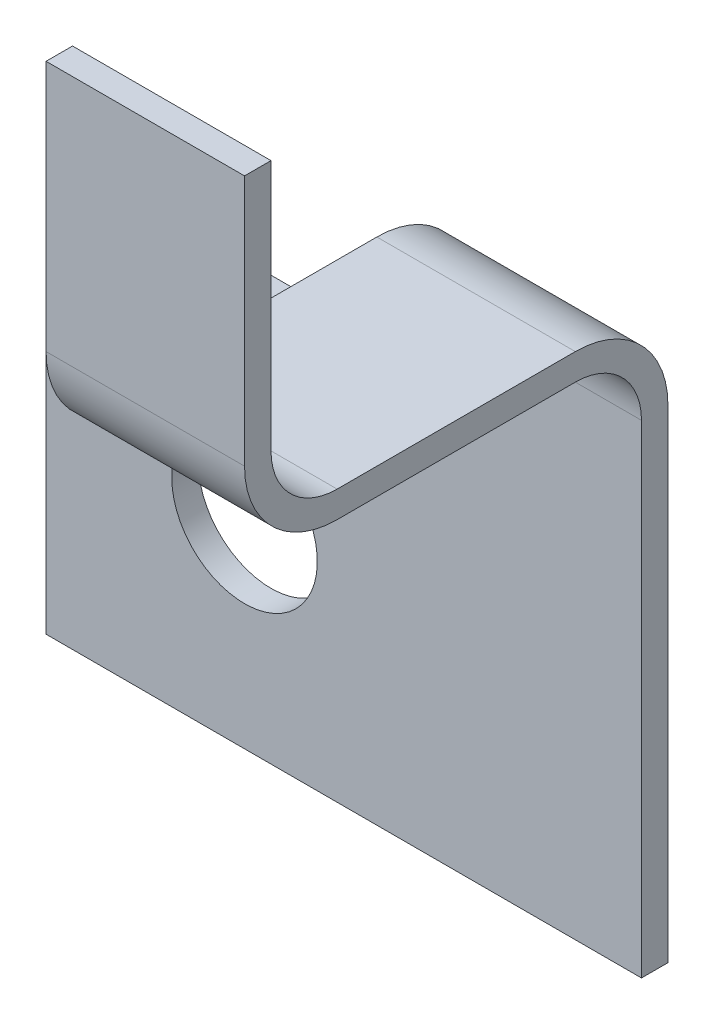
ISO-10303-21;
HEADER;
FILE_DESCRIPTION(('STEP AP214'),'2;1');
FILE_NAME('part.step','',(''),(''),'','','');
FILE_SCHEMA(('AUTOMOTIVE_DESIGN { 1 0 10303 214 1 1 1 1 }'));
ENDSEC;
DATA;
#1=APPLICATION_CONTEXT('core data for automotive mechanical design processes');
#2=APPLICATION_PROTOCOL_DEFINITION('international standard','automotive_design',2000,#1);
#3=PRODUCT_CONTEXT('',#1,'mechanical');
#4=PRODUCT('Part','Part','',(#3));
#5=PRODUCT_RELATED_PRODUCT_CATEGORY('part','',(#4));
#6=PRODUCT_DEFINITION_FORMATION('','',#4);
#7=PRODUCT_DEFINITION_CONTEXT('part definition',#1,'design');
#8=PRODUCT_DEFINITION('design','',#6,#7);
#9=PRODUCT_DEFINITION_SHAPE('','',#8);
#10=(LENGTH_UNIT() NAMED_UNIT(*) SI_UNIT(.MILLI.,.METRE.));
#11=(NAMED_UNIT(*) PLANE_ANGLE_UNIT() SI_UNIT($,.RADIAN.));
#12=(NAMED_UNIT(*) SI_UNIT($,.STERADIAN.) SOLID_ANGLE_UNIT());
#13=UNCERTAINTY_MEASURE_WITH_UNIT(LENGTH_MEASURE(1.E-05),#10,'distance_accuracy_value','');
#14=(GEOMETRIC_REPRESENTATION_CONTEXT(3) GLOBAL_UNCERTAINTY_ASSIGNED_CONTEXT((#13)) GLOBAL_UNIT_ASSIGNED_CONTEXT((#10,
#11,#12)) REPRESENTATION_CONTEXT('',''));
#15=CARTESIAN_POINT('',(0.,0.,0.));
#16=DIRECTION('',(0.,0.,1.));
#17=DIRECTION('',(1.,0.,0.));
#18=AXIS2_PLACEMENT_3D('',#15,#16,#17);
#19=CARTESIAN_POINT('',(21.9999990157581,-229.284034411765,25.8000000914921));
#20=DIRECTION('',(1.,0.,0.));
#21=DIRECTION('',(0.,0.,-1.));
#22=AXIS2_PLACEMENT_3D('',#19,#20,#21);
#23=PLANE('',#22);
#24=DIRECTION('',(0.,0.,1.));
#25=VECTOR('',#24,1.);
#26=CARTESIAN_POINT('',(21.9999990157581,-238.884034411765,13.0000000914921));
#27=LINE('',#26,#25);
#28=CARTESIAN_POINT('',(21.9999990157581,-238.884034411765,15.8000000914921));
#29=VERTEX_POINT('',#28);
#30=CARTESIAN_POINT('',(21.9999990157581,-238.884034411765,23.0000000914921));
#31=VERTEX_POINT('',#30);
#32=EDGE_CURVE('E242',#29,#31,#27,.T.);
#33=ORIENTED_EDGE('',*,*,#32,.F.);
#34=CARTESIAN_POINT('',(21.9999990157581,-241.684034411765,15.8000000914921));
#35=DIRECTION('',(1.,0.,0.));
#36=DIRECTION('',(0.,0.,-1.));
#37=AXIS2_PLACEMENT_3D('',#34,#35,#36);
#38=CIRCLE('',#37,2.8);
#39=CARTESIAN_POINT('',(21.9999990157581,-241.684034411765,13.0000000914921));
#40=VERTEX_POINT('',#39);
#41=EDGE_CURVE('E52',#29,#40,#38,.F.);
#42=ORIENTED_EDGE('',*,*,#41,.T.);
#43=DIRECTION('',(0.,1.,0.));
#44=VECTOR('',#43,1.);
#45=CARTESIAN_POINT('',(21.9999990157581,-256.284034411765,13.0000000914921));
#46=LINE('',#45,#44);
#47=CARTESIAN_POINT('',(21.9999990157581,-244.284034411765,13.0000000914921));
#48=VERTEX_POINT('',#47);
#49=EDGE_CURVE('E176',#48,#40,#46,.T.);
#50=ORIENTED_EDGE('',*,*,#49,.F.);
#51=DIRECTION('',(0.,0.,-1.));
#52=VECTOR('',#51,1.);
#53=CARTESIAN_POINT('',(21.9999990157581,-244.284034411765,13.0000000914921));
#54=LINE('',#53,#52);
#55=CARTESIAN_POINT('',(21.9999990157581,-244.284034411765,13.8000000914921));
#56=VERTEX_POINT('',#55);
#57=EDGE_CURVE('E150',#56,#48,#54,.T.);
#58=ORIENTED_EDGE('',*,*,#57,.F.);
#59=DIRECTION('',(0.,1.,0.));
#60=VECTOR('',#59,1.);
#61=CARTESIAN_POINT('',(21.9999990157581,-256.284034411765,13.8000000914921));
#62=LINE('',#61,#60);
#63=CARTESIAN_POINT('',(21.9999990157581,-241.684034411765,13.8000000914921));
#64=VERTEX_POINT('',#63);
#65=EDGE_CURVE('E177',#56,#64,#62,.T.);
#66=ORIENTED_EDGE('',*,*,#65,.T.);
#67=CARTESIAN_POINT('',(21.9999990157581,-241.684034411765,15.8000000914921));
#68=DIRECTION('',(1.,0.,0.));
#69=DIRECTION('',(0.,0.,-1.));
#70=AXIS2_PLACEMENT_3D('',#67,#68,#69);
#71=CIRCLE('',#70,2.);
#72=CARTESIAN_POINT('',(21.9999990157581,-239.684034411765,15.8000000914921));
#73=VERTEX_POINT('',#72);
#74=EDGE_CURVE('E231',#64,#73,#71,.T.);
#75=ORIENTED_EDGE('',*,*,#74,.T.);
#76=DIRECTION('',(0.,0.,1.));
#77=VECTOR('',#76,1.);
#78=CARTESIAN_POINT('',(21.9999990157581,-239.684034411765,13.8000000914921));
#79=LINE('',#78,#77);
#80=CARTESIAN_POINT('',(21.9999990157581,-239.684034411765,23.0000000914921));
#81=VERTEX_POINT('',#80);
#82=EDGE_CURVE('E161',#73,#81,#79,.T.);
#83=ORIENTED_EDGE('',*,*,#82,.T.);
#84=CARTESIAN_POINT('',(21.9999990157581,-236.884034411765,23.0000000914921));
#85=DIRECTION('',(1.,0.,0.));
#86=DIRECTION('',(0.,0.,-1.));
#87=AXIS2_PLACEMENT_3D('',#84,#85,#86);
#88=CIRCLE('',#87,2.8);
#89=CARTESIAN_POINT('',(21.9999990157581,-236.884034411765,25.8000000914921));
#90=VERTEX_POINT('',#89);
#91=EDGE_CURVE('E214',#81,#90,#88,.F.);
#92=ORIENTED_EDGE('',*,*,#91,.T.);
#93=DIRECTION('',(0.,-1.,0.));
#94=VECTOR('',#93,1.);
#95=CARTESIAN_POINT('',(21.9999990157581,-229.284034411765,25.8000000914921));
#96=LINE('',#95,#94);
#97=CARTESIAN_POINT('',(21.9999990157581,-229.284034411765,25.8000000914921));
#98=VERTEX_POINT('',#97);
#99=EDGE_CURVE('E196',#98,#90,#96,.T.);
#100=ORIENTED_EDGE('',*,*,#99,.F.);
#101=DIRECTION('',(0.,0.,1.));
#102=VECTOR('',#101,1.);
#103=CARTESIAN_POINT('',(21.9999990157581,-229.284034411765,13.0000000914921));
#104=LINE('',#103,#102);
#105=CARTESIAN_POINT('',(21.9999990157581,-229.284034411765,25.0000000914921));
#106=VERTEX_POINT('',#105);
#107=EDGE_CURVE('E170',#106,#98,#104,.T.);
#108=ORIENTED_EDGE('',*,*,#107,.F.);
#109=DIRECTION('',(0.,1.,0.));
#110=VECTOR('',#109,1.);
#111=CARTESIAN_POINT('',(21.9999990157581,-238.884034411765,25.0000000914921));
#112=LINE('',#111,#110);
#113=CARTESIAN_POINT('',(21.9999990157581,-236.884034411765,25.0000000914921));
#114=VERTEX_POINT('',#113);
#115=EDGE_CURVE('E147',#114,#106,#112,.T.);
#116=ORIENTED_EDGE('',*,*,#115,.F.);
#117=CARTESIAN_POINT('',(21.9999990157581,-236.884034411765,23.0000000914921));
#118=DIRECTION('',(1.,0.,0.));
#119=DIRECTION('',(0.,0.,-1.));
#120=AXIS2_PLACEMENT_3D('',#117,#118,#119);
#121=CIRCLE('',#120,2.);
#122=EDGE_CURVE('E223',#114,#31,#121,.T.);
#123=ORIENTED_EDGE('',*,*,#122,.T.);
#124=EDGE_LOOP('',(#33,#42,#50,#58,#66,#75,#83,#92,#100,#108,#116,#123));
#125=FACE_BOUND('',#124,.T.);
#126=ADVANCED_FACE('F30',(#125),#23,.F.);
#127=CARTESIAN_POINT('',(21.9999990157581,-229.284034411765,13.0000000914921));
#128=DIRECTION('',(0.,1.,0.));
#129=DIRECTION('',(0.,0.,1.));
#130=AXIS2_PLACEMENT_3D('',#127,#128,#129);
#131=PLANE('',#130);
#132=DIRECTION('',(-1.,0.,0.));
#133=VECTOR('',#132,1.);
#134=CARTESIAN_POINT('',(27.9999990157581,-229.284034411765,25.0000000914921));
#135=LINE('',#134,#133);
#136=CARTESIAN_POINT('',(27.9999990157581,-229.284034411765,25.0000000914921));
#137=VERTEX_POINT('',#136);
#138=EDGE_CURVE('E141',#137,#106,#135,.T.);
#139=ORIENTED_EDGE('',*,*,#138,.T.);
#140=ORIENTED_EDGE('',*,*,#107,.T.);
#141=DIRECTION('',(1.,0.,0.));
#142=VECTOR('',#141,1.);
#143=CARTESIAN_POINT('',(21.9999990157581,-229.284034411765,25.8000000914921));
#144=LINE('',#143,#142);
#145=CARTESIAN_POINT('',(27.9999990157581,-229.284034411765,25.8000000914921));
#146=VERTEX_POINT('',#145);
#147=EDGE_CURVE('E154',#98,#146,#144,.T.);
#148=ORIENTED_EDGE('',*,*,#147,.T.);
#149=DIRECTION('',(0.,0.,1.));
#150=VECTOR('',#149,1.);
#151=CARTESIAN_POINT('',(27.9999990157581,-229.284034411765,13.0000000914921));
#152=LINE('',#151,#150);
#153=EDGE_CURVE('E134',#137,#146,#152,.T.);
#154=ORIENTED_EDGE('',*,*,#153,.F.);
#155=EDGE_LOOP('',(#139,#140,#148,#154));
#156=FACE_BOUND('',#155,.T.);
#157=ADVANCED_FACE('F152',(#156),#131,.T.);
#158=CARTESIAN_POINT('',(21.9999990157581,-256.284034411765,13.0000000914921));
#159=DIRECTION('',(0.,0.,-1.));
#160=DIRECTION('',(-1.,0.,0.));
#161=AXIS2_PLACEMENT_3D('',#158,#159,#160);
#162=PLANE('',#161);
#163=CARTESIAN_POINT('',(15.9999990157581,-250.284034411765,13.0000000914921));
#164=DIRECTION('',(0.,0.,-1.));
#165=DIRECTION('',(-1.,0.,0.));
#166=AXIS2_PLACEMENT_3D('',#163,#164,#165);
#167=CIRCLE('',#166,2.20000000000002);
#168=CARTESIAN_POINT('',(13.799999015758,-250.284034411765,13.0000000914921));
#169=VERTEX_POINT('',#168);
#170=EDGE_CURVE('E243',#169,#169,#167,.T.);
#171=ORIENTED_EDGE('',*,*,#170,.F.);
#172=EDGE_LOOP('',(#171));
#173=FACE_BOUND('',#172,.T.);
#174=ORIENTED_EDGE('',*,*,#49,.T.);
#175=DIRECTION('',(-1.,0.,0.));
#176=VECTOR('',#175,1.);
#177=CARTESIAN_POINT('',(27.9999990157581,-241.684034411765,13.0000000914921));
#178=LINE('',#177,#176);
#179=CARTESIAN_POINT('',(27.9999990157581,-241.684034411765,13.0000000914921));
#180=VERTEX_POINT('',#179);
#181=EDGE_CURVE('E38',#40,#180,#178,.F.);
#182=ORIENTED_EDGE('',*,*,#181,.T.);
#183=DIRECTION('',(0.,1.,0.));
#184=VECTOR('',#183,1.);
#185=CARTESIAN_POINT('',(27.9999990157581,-256.284034411765,13.0000000914921));
#186=LINE('',#185,#184);
#187=CARTESIAN_POINT('',(27.9999990157581,-256.284034411765,13.0000000914921));
#188=VERTEX_POINT('',#187);
#189=EDGE_CURVE('E168',#188,#180,#186,.T.);
#190=ORIENTED_EDGE('',*,*,#189,.F.);
#191=DIRECTION('',(1.,0.,0.));
#192=VECTOR('',#191,1.);
#193=CARTESIAN_POINT('',(21.9999990157581,-256.284034411765,13.0000000914921));
#194=LINE('',#193,#192);
#195=CARTESIAN_POINT('',(9.99999901575808,-256.284034411765,13.0000000914921));
#196=VERTEX_POINT('',#195);
#197=EDGE_CURVE('E171',#196,#188,#194,.T.);
#198=ORIENTED_EDGE('',*,*,#197,.F.);
#199=DIRECTION('',(0.,-1.,0.));
#200=VECTOR('',#199,1.);
#201=CARTESIAN_POINT('',(9.99999901575808,-256.284034411765,13.0000000914921));
#202=LINE('',#201,#200);
#203=CARTESIAN_POINT('',(9.99999901575808,-244.284034411765,13.0000000914921));
#204=VERTEX_POINT('',#203);
#205=EDGE_CURVE('E255',#204,#196,#202,.T.);
#206=ORIENTED_EDGE('',*,*,#205,.F.);
#207=DIRECTION('',(1.,0.,0.));
#208=VECTOR('',#207,1.);
#209=CARTESIAN_POINT('',(9.99999901575808,-244.284034411765,13.0000000914921));
#210=LINE('',#209,#208);
#211=EDGE_CURVE('E193',#204,#48,#210,.T.);
#212=ORIENTED_EDGE('',*,*,#211,.T.);
#213=EDGE_LOOP('',(#174,#182,#190,#198,#206,#212));
#214=FACE_BOUND('',#213,.T.);
#215=ADVANCED_FACE('F203',(#173,#214),#162,.T.);
#216=CARTESIAN_POINT('',(21.9999990157581,-256.284034411765,25.8000000914921));
#217=DIRECTION('',(0.,-1.,0.));
#218=DIRECTION('',(0.,0.,-1.));
#219=AXIS2_PLACEMENT_3D('',#216,#217,#218);
#220=PLANE('',#219);
#221=DIRECTION('',(1.,0.,0.));
#222=VECTOR('',#221,1.);
#223=CARTESIAN_POINT('',(21.9999990157581,-256.284034411765,13.8000000914921));
#224=LINE('',#223,#222);
#225=CARTESIAN_POINT('',(9.99999901575808,-256.284034411765,13.8000000914921));
#226=VERTEX_POINT('',#225);
#227=CARTESIAN_POINT('',(27.9999990157581,-256.284034411765,13.8000000914921));
#228=VERTEX_POINT('',#227);
#229=EDGE_CURVE('E157',#226,#228,#224,.T.);
#230=ORIENTED_EDGE('',*,*,#229,.F.);
#231=DIRECTION('',(0.,0.,1.));
#232=VECTOR('',#231,1.);
#233=CARTESIAN_POINT('',(9.99999901575808,-256.284034411765,13.8000000914921));
#234=LINE('',#233,#232);
#235=EDGE_CURVE('E260',#196,#226,#234,.T.);
#236=ORIENTED_EDGE('',*,*,#235,.F.);
#237=ORIENTED_EDGE('',*,*,#197,.T.);
#238=DIRECTION('',(0.,0.,-1.));
#239=VECTOR('',#238,1.);
#240=CARTESIAN_POINT('',(27.9999990157581,-256.284034411765,25.8000000914921));
#241=LINE('',#240,#239);
#242=EDGE_CURVE('E159',#228,#188,#241,.T.);
#243=ORIENTED_EDGE('',*,*,#242,.F.);
#244=EDGE_LOOP('',(#230,#236,#237,#243));
#245=FACE_BOUND('',#244,.T.);
#246=ADVANCED_FACE('F296',(#245),#220,.T.);
#247=CARTESIAN_POINT('',(21.9999990157581,-229.284034411765,25.8000000914921));
#248=DIRECTION('',(0.,0.,1.));
#249=DIRECTION('',(0.,-1.,0.));
#250=AXIS2_PLACEMENT_3D('',#247,#248,#249);
#251=PLANE('',#250);
#252=ORIENTED_EDGE('',*,*,#99,.T.);
#253=DIRECTION('',(1.,0.,0.));
#254=VECTOR('',#253,1.);
#255=CARTESIAN_POINT('',(27.9999990157581,-236.884034411765,25.8000000914921));
#256=LINE('',#255,#254);
#257=CARTESIAN_POINT('',(27.9999990157581,-236.884034411765,25.8000000914921));
#258=VERTEX_POINT('',#257);
#259=EDGE_CURVE('E220',#90,#258,#256,.T.);
#260=ORIENTED_EDGE('',*,*,#259,.T.);
#261=DIRECTION('',(0.,-1.,0.));
#262=VECTOR('',#261,1.);
#263=CARTESIAN_POINT('',(27.9999990157581,-229.284034411765,25.8000000914921));
#264=LINE('',#263,#262);
#265=EDGE_CURVE('E156',#146,#258,#264,.T.);
#266=ORIENTED_EDGE('',*,*,#265,.F.);
#267=ORIENTED_EDGE('',*,*,#147,.F.);
#268=EDGE_LOOP('',(#252,#260,#266,#267));
#269=FACE_BOUND('',#268,.T.);
#270=ADVANCED_FACE('F293',(#269),#251,.T.);
#271=CARTESIAN_POINT('',(27.9999990157581,-229.284034411765,25.8000000914921));
#272=DIRECTION('',(1.,0.,0.));
#273=DIRECTION('',(0.,0.,-1.));
#274=AXIS2_PLACEMENT_3D('',#271,#272,#273);
#275=PLANE('',#274);
#276=ORIENTED_EDGE('',*,*,#189,.T.);
#277=CARTESIAN_POINT('',(27.9999990157581,-241.684034411765,15.8000000914921));
#278=DIRECTION('',(1.,0.,0.));
#279=DIRECTION('',(0.,0.,-1.));
#280=AXIS2_PLACEMENT_3D('',#277,#278,#279);
#281=CIRCLE('',#280,2.8);
#282=CARTESIAN_POINT('',(27.9999990157581,-238.884034411765,15.8000000914921));
#283=VERTEX_POINT('',#282);
#284=EDGE_CURVE('E11',#180,#283,#281,.T.);
#285=ORIENTED_EDGE('',*,*,#284,.T.);
#286=DIRECTION('',(0.,0.,1.));
#287=VECTOR('',#286,1.);
#288=CARTESIAN_POINT('',(27.9999990157581,-238.884034411765,13.0000000914921));
#289=LINE('',#288,#287);
#290=CARTESIAN_POINT('',(27.9999990157581,-238.884034411765,23.0000000914921));
#291=VERTEX_POINT('',#290);
#292=EDGE_CURVE('E142',#283,#291,#289,.T.);
#293=ORIENTED_EDGE('',*,*,#292,.T.);
#294=CARTESIAN_POINT('',(27.9999990157581,-236.884034411765,23.0000000914921));
#295=DIRECTION('',(1.,0.,0.));
#296=DIRECTION('',(0.,0.,-1.));
#297=AXIS2_PLACEMENT_3D('',#294,#295,#296);
#298=CIRCLE('',#297,2.);
#299=CARTESIAN_POINT('',(27.9999990157581,-236.884034411765,25.0000000914921));
#300=VERTEX_POINT('',#299);
#301=EDGE_CURVE('E137',#291,#300,#298,.F.);
#302=ORIENTED_EDGE('',*,*,#301,.T.);
#303=DIRECTION('',(0.,1.,0.));
#304=VECTOR('',#303,1.);
#305=CARTESIAN_POINT('',(27.9999990157581,-238.884034411765,25.0000000914921));
#306=LINE('',#305,#304);
#307=EDGE_CURVE('E129',#300,#137,#306,.T.);
#308=ORIENTED_EDGE('',*,*,#307,.T.);
#309=ORIENTED_EDGE('',*,*,#153,.T.);
#310=ORIENTED_EDGE('',*,*,#265,.T.);
#311=CARTESIAN_POINT('',(27.9999990157581,-236.884034411765,23.0000000914921));
#312=DIRECTION('',(1.,0.,0.));
#313=DIRECTION('',(0.,0.,-1.));
#314=AXIS2_PLACEMENT_3D('',#311,#312,#313);
#315=CIRCLE('',#314,2.8);
#316=CARTESIAN_POINT('',(27.9999990157581,-239.684034411765,23.0000000914921));
#317=VERTEX_POINT('',#316);
#318=EDGE_CURVE('E218',#258,#317,#315,.T.);
#319=ORIENTED_EDGE('',*,*,#318,.T.);
#320=DIRECTION('',(0.,0.,1.));
#321=VECTOR('',#320,1.);
#322=CARTESIAN_POINT('',(27.9999990157581,-239.684034411765,13.8000000914921));
#323=LINE('',#322,#321);
#324=CARTESIAN_POINT('',(27.9999990157581,-239.684034411765,15.8000000914921));
#325=VERTEX_POINT('',#324);
#326=EDGE_CURVE('E181',#325,#317,#323,.T.);
#327=ORIENTED_EDGE('',*,*,#326,.F.);
#328=CARTESIAN_POINT('',(27.9999990157581,-241.684034411765,15.8000000914921));
#329=DIRECTION('',(1.,0.,0.));
#330=DIRECTION('',(0.,0.,-1.));
#331=AXIS2_PLACEMENT_3D('',#328,#329,#330);
#332=CIRCLE('',#331,2.);
#333=CARTESIAN_POINT('',(27.9999990157581,-241.684034411765,13.8000000914921));
#334=VERTEX_POINT('',#333);
#335=EDGE_CURVE('E233',#325,#334,#332,.F.);
#336=ORIENTED_EDGE('',*,*,#335,.T.);
#337=DIRECTION('',(0.,1.,0.));
#338=VECTOR('',#337,1.);
#339=CARTESIAN_POINT('',(27.9999990157581,-256.284034411765,13.8000000914921));
#340=LINE('',#339,#338);
#341=EDGE_CURVE('E190',#228,#334,#340,.T.);
#342=ORIENTED_EDGE('',*,*,#341,.F.);
#343=ORIENTED_EDGE('',*,*,#242,.T.);
#344=EDGE_LOOP('',(#276,#285,#293,#302,#308,#309,#310,#319,#327,#336,#342,#343));
#345=FACE_BOUND('',#344,.T.);
#346=ADVANCED_FACE('F131',(#345),#275,.T.);
#347=CARTESIAN_POINT('',(21.9999990157581,-239.684034411765,13.8000000914921));
#348=DIRECTION('',(0.,1.,0.));
#349=DIRECTION('',(0.,0.,1.));
#350=AXIS2_PLACEMENT_3D('',#347,#348,#349);
#351=PLANE('',#350);
#352=ORIENTED_EDGE('',*,*,#326,.T.);
#353=DIRECTION('',(1.,0.,0.));
#354=VECTOR('',#353,1.);
#355=CARTESIAN_POINT('',(21.9999990157581,-239.684034411765,23.0000000914921));
#356=LINE('',#355,#354);
#357=EDGE_CURVE('E216',#317,#81,#356,.F.);
#358=ORIENTED_EDGE('',*,*,#357,.T.);
#359=ORIENTED_EDGE('',*,*,#82,.F.);
#360=DIRECTION('',(1.,0.,0.));
#361=VECTOR('',#360,1.);
#362=CARTESIAN_POINT('',(27.9999990157581,-239.684034411765,15.8000000914921));
#363=LINE('',#362,#361);
#364=EDGE_CURVE('E174',#73,#325,#363,.T.);
#365=ORIENTED_EDGE('',*,*,#364,.T.);
#366=EDGE_LOOP('',(#352,#358,#359,#365));
#367=FACE_BOUND('',#366,.T.);
#368=ADVANCED_FACE('F280',(#367),#351,.F.);
#369=CARTESIAN_POINT('',(21.9999990157581,-256.284034411765,13.8000000914921));
#370=DIRECTION('',(0.,0.,-1.));
#371=DIRECTION('',(0.,1.,0.));
#372=AXIS2_PLACEMENT_3D('',#369,#370,#371);
#373=PLANE('',#372);
#374=CARTESIAN_POINT('',(15.9999990157581,-250.284034411765,13.8000000914921));
#375=DIRECTION('',(0.,0.,-1.));
#376=DIRECTION('',(0.,1.,0.));
#377=AXIS2_PLACEMENT_3D('',#374,#375,#376);
#378=CIRCLE('',#377,2.20000000000002);
#379=CARTESIAN_POINT('',(15.9999990157581,-248.084034411765,13.8000000914921));
#380=VERTEX_POINT('',#379);
#381=EDGE_CURVE('E239',#380,#380,#378,.T.);
#382=ORIENTED_EDGE('',*,*,#381,.T.);
#383=EDGE_LOOP('',(#382));
#384=FACE_BOUND('',#383,.T.);
#385=ORIENTED_EDGE('',*,*,#341,.T.);
#386=DIRECTION('',(1.,0.,0.));
#387=VECTOR('',#386,1.);
#388=CARTESIAN_POINT('',(21.9999990157581,-241.684034411765,13.8000000914921));
#389=LINE('',#388,#387);
#390=EDGE_CURVE('E235',#334,#64,#389,.F.);
#391=ORIENTED_EDGE('',*,*,#390,.T.);
#392=ORIENTED_EDGE('',*,*,#65,.F.);
#393=DIRECTION('',(1.,0.,0.));
#394=VECTOR('',#393,1.);
#395=CARTESIAN_POINT('',(9.99999901575808,-244.284034411765,13.8000000914921));
#396=LINE('',#395,#394);
#397=CARTESIAN_POINT('',(9.99999901575808,-244.284034411765,13.8000000914921));
#398=VERTEX_POINT('',#397);
#399=EDGE_CURVE('E246',#398,#56,#396,.T.);
#400=ORIENTED_EDGE('',*,*,#399,.F.);
#401=DIRECTION('',(0.,1.,0.));
#402=VECTOR('',#401,1.);
#403=CARTESIAN_POINT('',(9.99999901575808,-244.284034411765,13.8000000914921));
#404=LINE('',#403,#402);
#405=EDGE_CURVE('E249',#226,#398,#404,.T.);
#406=ORIENTED_EDGE('',*,*,#405,.F.);
#407=ORIENTED_EDGE('',*,*,#229,.T.);
#408=EDGE_LOOP('',(#385,#391,#392,#400,#406,#407));
#409=FACE_BOUND('',#408,.T.);
#410=ADVANCED_FACE('F271',(#384,#409),#373,.F.);
#411=CARTESIAN_POINT('',(9.99999901575808,-244.284034411765,13.0000000914921));
#412=DIRECTION('',(0.,-1.,0.));
#413=DIRECTION('',(0.,0.,-1.));
#414=AXIS2_PLACEMENT_3D('',#411,#412,#413);
#415=PLANE('',#414);
#416=ORIENTED_EDGE('',*,*,#57,.T.);
#417=ORIENTED_EDGE('',*,*,#211,.F.);
#418=DIRECTION('',(0.,0.,-1.));
#419=VECTOR('',#418,1.);
#420=CARTESIAN_POINT('',(9.99999901575808,-244.284034411765,13.0000000914921));
#421=LINE('',#420,#419);
#422=EDGE_CURVE('E251',#398,#204,#421,.T.);
#423=ORIENTED_EDGE('',*,*,#422,.F.);
#424=ORIENTED_EDGE('',*,*,#399,.T.);
#425=EDGE_LOOP('',(#416,#417,#423,#424));
#426=FACE_BOUND('',#425,.T.);
#427=ADVANCED_FACE('F272',(#426),#415,.F.);
#428=CARTESIAN_POINT('',(9.99999901575808,-244.284034411765,13.8000000914921));
#429=DIRECTION('',(1.,0.,0.));
#430=DIRECTION('',(0.,0.,-1.));
#431=AXIS2_PLACEMENT_3D('',#428,#429,#430);
#432=PLANE('',#431);
#433=ORIENTED_EDGE('',*,*,#422,.T.);
#434=ORIENTED_EDGE('',*,*,#205,.T.);
#435=ORIENTED_EDGE('',*,*,#235,.T.);
#436=ORIENTED_EDGE('',*,*,#405,.T.);
#437=EDGE_LOOP('',(#433,#434,#435,#436));
#438=FACE_BOUND('',#437,.T.);
#439=ADVANCED_FACE('F267',(#438),#432,.F.);
#440=CARTESIAN_POINT('',(27.9999990157581,-238.884034411765,25.0000000914921));
#441=DIRECTION('',(0.,0.,1.));
#442=DIRECTION('',(1.,0.,0.));
#443=AXIS2_PLACEMENT_3D('',#440,#441,#442);
#444=PLANE('',#443);
#445=ORIENTED_EDGE('',*,*,#307,.F.);
#446=DIRECTION('',(-1.,0.,0.));
#447=VECTOR('',#446,1.);
#448=CARTESIAN_POINT('',(21.9999990157581,-236.884034411765,25.0000000914921));
#449=LINE('',#448,#447);
#450=EDGE_CURVE('E229',#300,#114,#449,.T.);
#451=ORIENTED_EDGE('',*,*,#450,.T.);
#452=ORIENTED_EDGE('',*,*,#115,.T.);
#453=ORIENTED_EDGE('',*,*,#138,.F.);
#454=EDGE_LOOP('',(#445,#451,#452,#453));
#455=FACE_BOUND('',#454,.T.);
#456=ADVANCED_FACE('F145',(#455),#444,.F.);
#457=CARTESIAN_POINT('',(27.9999990157581,-238.884034411765,13.0000000914921));
#458=DIRECTION('',(0.,-1.,0.));
#459=DIRECTION('',(0.,0.,-1.));
#460=AXIS2_PLACEMENT_3D('',#457,#458,#459);
#461=PLANE('',#460);
#462=ORIENTED_EDGE('',*,*,#292,.F.);
#463=DIRECTION('',(-1.,0.,0.));
#464=VECTOR('',#463,1.);
#465=CARTESIAN_POINT('',(21.9999990157581,-238.884034411765,15.8000000914921));
#466=LINE('',#465,#464);
#467=EDGE_CURVE('E210',#283,#29,#466,.T.);
#468=ORIENTED_EDGE('',*,*,#467,.T.);
#469=ORIENTED_EDGE('',*,*,#32,.T.);
#470=DIRECTION('',(-1.,0.,0.));
#471=VECTOR('',#470,1.);
#472=CARTESIAN_POINT('',(27.9999990157581,-238.884034411765,23.0000000914921));
#473=LINE('',#472,#471);
#474=EDGE_CURVE('E226',#31,#291,#473,.F.);
#475=ORIENTED_EDGE('',*,*,#474,.T.);
#476=EDGE_LOOP('',(#462,#468,#469,#475));
#477=FACE_BOUND('',#476,.T.);
#478=ADVANCED_FACE('F329',(#477),#461,.F.);
#479=CARTESIAN_POINT('',(15.9999990157581,-250.284034411765,13.0000000914921));
#480=DIRECTION('',(0.,0.,-1.));
#481=DIRECTION('',(-1.,0.,0.));
#482=AXIS2_PLACEMENT_3D('',#479,#480,#481);
#483=CYLINDRICAL_SURFACE('',#482,2.20000000000002);
#484=ORIENTED_EDGE('',*,*,#170,.T.);
#485=EDGE_LOOP('',(#484));
#486=FACE_BOUND('',#485,.T.);
#487=ORIENTED_EDGE('',*,*,#381,.F.);
#488=EDGE_LOOP('',(#487));
#489=FACE_BOUND('',#488,.T.);
#490=ADVANCED_FACE('F307',(#486,#489),#483,.F.);
#491=CARTESIAN_POINT('',(21.9999990157581,-241.684034411765,15.8000000914921));
#492=DIRECTION('',(-1.,0.,0.));
#493=DIRECTION('',(0.,0.,1.));
#494=AXIS2_PLACEMENT_3D('',#491,#492,#493);
#495=CYLINDRICAL_SURFACE('',#494,2.);
#496=ORIENTED_EDGE('',*,*,#74,.F.);
#497=ORIENTED_EDGE('',*,*,#390,.F.);
#498=ORIENTED_EDGE('',*,*,#335,.F.);
#499=ORIENTED_EDGE('',*,*,#364,.F.);
#500=EDGE_LOOP('',(#496,#497,#498,#499));
#501=FACE_BOUND('',#500,.T.);
#502=ADVANCED_FACE('F303',(#501),#495,.F.);
#503=CARTESIAN_POINT('',(27.9999990157581,-236.884034411765,23.0000000914921));
#504=DIRECTION('',(1.,0.,0.));
#505=DIRECTION('',(0.,0.,-1.));
#506=AXIS2_PLACEMENT_3D('',#503,#504,#505);
#507=CYLINDRICAL_SURFACE('',#506,2.);
#508=ORIENTED_EDGE('',*,*,#301,.F.);
#509=ORIENTED_EDGE('',*,*,#474,.F.);
#510=ORIENTED_EDGE('',*,*,#122,.F.);
#511=ORIENTED_EDGE('',*,*,#450,.F.);
#512=EDGE_LOOP('',(#508,#509,#510,#511));
#513=FACE_BOUND('',#512,.T.);
#514=ADVANCED_FACE('F306',(#513),#507,.F.);
#515=CARTESIAN_POINT('',(21.9999990157581,-236.884034411765,23.0000000914921));
#516=DIRECTION('',(-1.,0.,0.));
#517=DIRECTION('',(0.,0.,1.));
#518=AXIS2_PLACEMENT_3D('',#515,#516,#517);
#519=CYLINDRICAL_SURFACE('',#518,2.8);
#520=ORIENTED_EDGE('',*,*,#91,.F.);
#521=ORIENTED_EDGE('',*,*,#357,.F.);
#522=ORIENTED_EDGE('',*,*,#318,.F.);
#523=ORIENTED_EDGE('',*,*,#259,.F.);
#524=EDGE_LOOP('',(#520,#521,#522,#523));
#525=FACE_BOUND('',#524,.T.);
#526=ADVANCED_FACE('F310',(#525),#519,.T.);
#527=CARTESIAN_POINT('',(27.9999990157581,-241.684034411765,15.8000000914921));
#528=DIRECTION('',(1.,0.,0.));
#529=DIRECTION('',(0.,0.,-1.));
#530=AXIS2_PLACEMENT_3D('',#527,#528,#529);
#531=CYLINDRICAL_SURFACE('',#530,2.8);
#532=ORIENTED_EDGE('',*,*,#284,.F.);
#533=ORIENTED_EDGE('',*,*,#181,.F.);
#534=ORIENTED_EDGE('',*,*,#41,.F.);
#535=ORIENTED_EDGE('',*,*,#467,.F.);
#536=EDGE_LOOP('',(#532,#533,#534,#535));
#537=FACE_BOUND('',#536,.T.);
#538=ADVANCED_FACE('F32',(#537),#531,.T.);
#539=CLOSED_SHELL('',(#126,#157,#215,#246,#270,#346,#368,#410,#427,#439,#456,#478,#490,#502,
#514,#526,#538));
#540=MANIFOLD_SOLID_BREP('B2',#539);
#541=ADVANCED_BREP_SHAPE_REPRESENTATION('',(#18,#540),#14);
#542=SHAPE_DEFINITION_REPRESENTATION(#9,#541);
ENDSEC;
END-ISO-10303-21;
